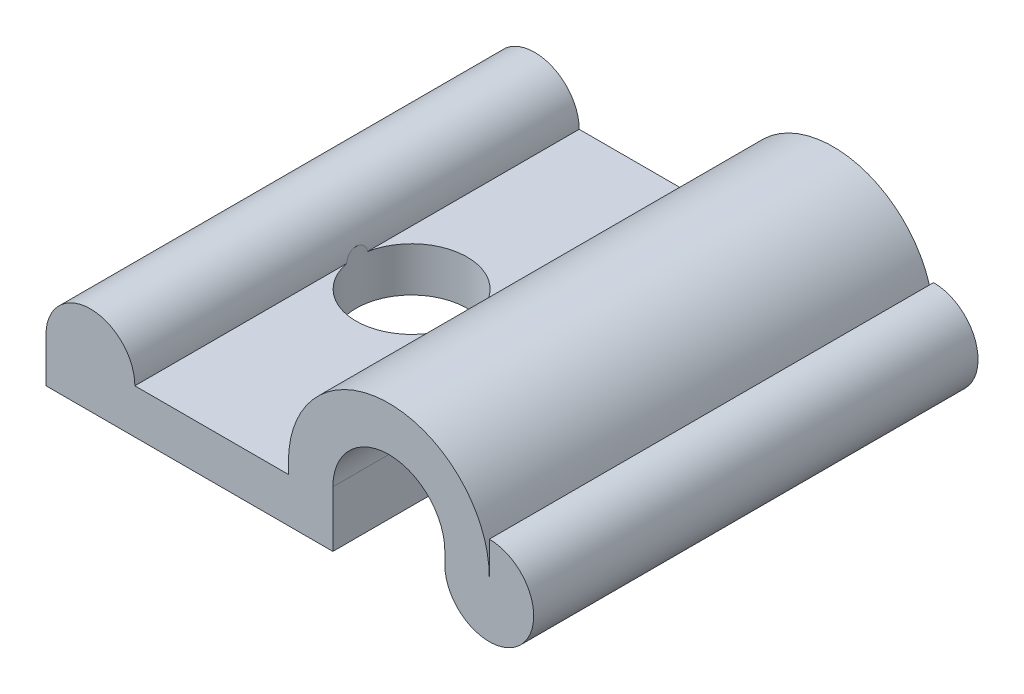
ISO-10303-21;
HEADER;
FILE_DESCRIPTION(('STEP AP214'),'2;1');
FILE_NAME('part.step','',(''),(''),'','','');
FILE_SCHEMA(('AUTOMOTIVE_DESIGN { 1 0 10303 214 1 1 1 1 }'));
ENDSEC;
DATA;
#1=APPLICATION_CONTEXT('core data for automotive mechanical design processes');
#2=APPLICATION_PROTOCOL_DEFINITION('international standard','automotive_design',2000,#1);
#3=PRODUCT_CONTEXT('',#1,'mechanical');
#4=PRODUCT('Part','Part','',(#3));
#5=PRODUCT_RELATED_PRODUCT_CATEGORY('part','',(#4));
#6=PRODUCT_DEFINITION_FORMATION('','',#4);
#7=PRODUCT_DEFINITION_CONTEXT('part definition',#1,'design');
#8=PRODUCT_DEFINITION('design','',#6,#7);
#9=PRODUCT_DEFINITION_SHAPE('','',#8);
#10=(LENGTH_UNIT() NAMED_UNIT(*) SI_UNIT(.MILLI.,.METRE.));
#11=(NAMED_UNIT(*) PLANE_ANGLE_UNIT() SI_UNIT($,.RADIAN.));
#12=(NAMED_UNIT(*) SI_UNIT($,.STERADIAN.) SOLID_ANGLE_UNIT());
#13=UNCERTAINTY_MEASURE_WITH_UNIT(LENGTH_MEASURE(1.E-05),#10,'distance_accuracy_value','');
#14=(GEOMETRIC_REPRESENTATION_CONTEXT(3) GLOBAL_UNCERTAINTY_ASSIGNED_CONTEXT((#13)) GLOBAL_UNIT_ASSIGNED_CONTEXT((#10,
#11,#12)) REPRESENTATION_CONTEXT('',''));
#15=CARTESIAN_POINT('',(0.,0.,0.));
#16=DIRECTION('',(0.,0.,1.));
#17=DIRECTION('',(1.,0.,0.));
#18=AXIS2_PLACEMENT_3D('',#15,#16,#17);
#19=CARTESIAN_POINT('',(-3.2,-3.2,12.7));
#20=DIRECTION('',(0.,1.,0.));
#21=DIRECTION('',(-1.,0.,0.));
#22=AXIS2_PLACEMENT_3D('',#19,#20,#21);
#23=PLANE('',#22);
#24=CARTESIAN_POINT('',(-11.4,-3.2,0.));
#25=DIRECTION('',(0.,-1.,0.));
#26=DIRECTION('',(1.,0.,0.));
#27=AXIS2_PLACEMENT_3D('',#24,#25,#26);
#28=CIRCLE('',#27,3.175);
#29=CARTESIAN_POINT('',(-8.225,-3.2,0.));
#30=VERTEX_POINT('',#29);
#31=EDGE_CURVE('E249',#30,#30,#28,.T.);
#32=ORIENTED_EDGE('',*,*,#31,.F.);
#33=EDGE_LOOP('',(#32));
#34=FACE_BOUND('',#33,.T.);
#35=DIRECTION('',(1.,0.,0.));
#36=VECTOR('',#35,1.);
#37=CARTESIAN_POINT('',(-3.2,-3.2,-12.7));
#38=LINE('',#37,#36);
#39=CARTESIAN_POINT('',(-19.6,-3.2,-12.7));
#40=VERTEX_POINT('',#39);
#41=CARTESIAN_POINT('',(-3.2,-3.2,-12.7));
#42=VERTEX_POINT('',#41);
#43=EDGE_CURVE('E159',#40,#42,#38,.T.);
#44=ORIENTED_EDGE('',*,*,#43,.T.);
#45=DIRECTION('',(0.,0.,-1.));
#46=VECTOR('',#45,1.);
#47=CARTESIAN_POINT('',(-3.2,-3.2,12.7));
#48=LINE('',#47,#46);
#49=CARTESIAN_POINT('',(-3.2,-3.2,12.7));
#50=VERTEX_POINT('',#49);
#51=EDGE_CURVE('E44',#50,#42,#48,.T.);
#52=ORIENTED_EDGE('',*,*,#51,.F.);
#53=DIRECTION('',(1.,0.,0.));
#54=VECTOR('',#53,1.);
#55=CARTESIAN_POINT('',(-3.2,-3.2,12.7));
#56=LINE('',#55,#54);
#57=CARTESIAN_POINT('',(-19.6,-3.2,12.7));
#58=VERTEX_POINT('',#57);
#59=EDGE_CURVE('E182',#58,#50,#56,.T.);
#60=ORIENTED_EDGE('',*,*,#59,.F.);
#61=DIRECTION('',(0.,0.,-1.));
#62=VECTOR('',#61,1.);
#63=CARTESIAN_POINT('',(-19.6,-3.2,12.7));
#64=LINE('',#63,#62);
#65=EDGE_CURVE('E155',#58,#40,#64,.T.);
#66=ORIENTED_EDGE('',*,*,#65,.T.);
#67=EDGE_LOOP('',(#44,#52,#60,#66));
#68=FACE_BOUND('',#67,.T.);
#69=ADVANCED_FACE('F32',(#34,#68),#23,.F.);
#70=CARTESIAN_POINT('',(-3.2,0.,12.7));
#71=DIRECTION('',(-1.,0.,0.));
#72=DIRECTION('',(0.,0.,1.));
#73=AXIS2_PLACEMENT_3D('',#70,#71,#72);
#74=PLANE('',#73);
#75=DIRECTION('',(0.,1.,0.));
#76=VECTOR('',#75,1.);
#77=CARTESIAN_POINT('',(-3.2,0.,-12.7));
#78=LINE('',#77,#76);
#79=CARTESIAN_POINT('',(-3.2,0.,-12.7));
#80=VERTEX_POINT('',#79);
#81=EDGE_CURVE('E162',#42,#80,#78,.T.);
#82=ORIENTED_EDGE('',*,*,#81,.T.);
#83=DIRECTION('',(0.,0.,-1.));
#84=VECTOR('',#83,1.);
#85=CARTESIAN_POINT('',(-3.2,0.,12.7));
#86=LINE('',#85,#84);
#87=CARTESIAN_POINT('',(-3.2,0.,12.7));
#88=VERTEX_POINT('',#87);
#89=EDGE_CURVE('E201',#88,#80,#86,.T.);
#90=ORIENTED_EDGE('',*,*,#89,.F.);
#91=DIRECTION('',(0.,1.,0.));
#92=VECTOR('',#91,1.);
#93=CARTESIAN_POINT('',(-3.2,0.,12.7));
#94=LINE('',#93,#92);
#95=EDGE_CURVE('E109',#50,#88,#94,.T.);
#96=ORIENTED_EDGE('',*,*,#95,.F.);
#97=ORIENTED_EDGE('',*,*,#51,.T.);
#98=EDGE_LOOP('',(#82,#90,#96,#97));
#99=FACE_BOUND('',#98,.T.);
#100=ADVANCED_FACE('F204',(#99),#74,.F.);
#101=CARTESIAN_POINT('',(0.,0.,12.7));
#102=DIRECTION('',(0.,0.,-1.));
#103=DIRECTION('',(-1.,0.,0.));
#104=AXIS2_PLACEMENT_3D('',#101,#102,#103);
#105=CYLINDRICAL_SURFACE('',#104,3.2);
#106=CARTESIAN_POINT('',(0.,0.,-12.7));
#107=DIRECTION('',(0.,0.,-1.));
#108=DIRECTION('',(1.,0.,0.));
#109=AXIS2_PLACEMENT_3D('',#106,#107,#108);
#110=CIRCLE('',#109,3.2);
#111=CARTESIAN_POINT('',(3.2,0.,-12.7));
#112=VERTEX_POINT('',#111);
#113=EDGE_CURVE('E164',#80,#112,#110,.T.);
#114=ORIENTED_EDGE('',*,*,#113,.T.);
#115=DIRECTION('',(0.,0.,-1.));
#116=VECTOR('',#115,1.);
#117=CARTESIAN_POINT('',(3.2,0.,12.7));
#118=LINE('',#117,#116);
#119=CARTESIAN_POINT('',(3.2,0.,12.7));
#120=VERTEX_POINT('',#119);
#121=EDGE_CURVE('E198',#120,#112,#118,.T.);
#122=ORIENTED_EDGE('',*,*,#121,.F.);
#123=CARTESIAN_POINT('',(0.,0.,12.7));
#124=DIRECTION('',(0.,0.,-1.));
#125=DIRECTION('',(1.,0.,0.));
#126=AXIS2_PLACEMENT_3D('',#123,#124,#125);
#127=CIRCLE('',#126,3.2);
#128=EDGE_CURVE('E225',#88,#120,#127,.T.);
#129=ORIENTED_EDGE('',*,*,#128,.F.);
#130=ORIENTED_EDGE('',*,*,#89,.T.);
#131=EDGE_LOOP('',(#114,#122,#129,#130));
#132=FACE_BOUND('',#131,.T.);
#133=ADVANCED_FACE('F216',(#132),#105,.F.);
#134=CARTESIAN_POINT('',(3.2,0.,12.7));
#135=DIRECTION('',(1.,0.,0.));
#136=DIRECTION('',(0.,0.,-1.));
#137=AXIS2_PLACEMENT_3D('',#134,#135,#136);
#138=PLANE('',#137);
#139=DIRECTION('',(0.,-1.,0.));
#140=VECTOR('',#139,1.);
#141=CARTESIAN_POINT('',(3.2,0.,-12.7));
#142=LINE('',#141,#140);
#143=CARTESIAN_POINT('',(3.2,-0.659999999999999,-12.7));
#144=VERTEX_POINT('',#143);
#145=EDGE_CURVE('E166',#112,#144,#142,.T.);
#146=ORIENTED_EDGE('',*,*,#145,.T.);
#147=DIRECTION('',(0.,0.,-1.));
#148=VECTOR('',#147,1.);
#149=CARTESIAN_POINT('',(3.2,-0.659999999999999,12.7));
#150=LINE('',#149,#148);
#151=CARTESIAN_POINT('',(3.2,-0.659999999999999,12.7));
#152=VERTEX_POINT('',#151);
#153=EDGE_CURVE('E195',#152,#144,#150,.T.);
#154=ORIENTED_EDGE('',*,*,#153,.F.);
#155=DIRECTION('',(0.,-1.,0.));
#156=VECTOR('',#155,1.);
#157=CARTESIAN_POINT('',(3.2,0.,12.7));
#158=LINE('',#157,#156);
#159=EDGE_CURVE('E222',#120,#152,#158,.T.);
#160=ORIENTED_EDGE('',*,*,#159,.F.);
#161=ORIENTED_EDGE('',*,*,#121,.T.);
#162=EDGE_LOOP('',(#146,#154,#160,#161));
#163=FACE_BOUND('',#162,.T.);
#164=ADVANCED_FACE('F220',(#163),#138,.F.);
#165=CARTESIAN_POINT('',(5.74,-0.659999999999999,12.7));
#166=DIRECTION('',(0.,0.,-1.));
#167=DIRECTION('',(-1.,0.,0.));
#168=AXIS2_PLACEMENT_3D('',#165,#166,#167);
#169=CYLINDRICAL_SURFACE('',#168,2.54);
#170=CARTESIAN_POINT('',(5.74,-0.659999999999999,-12.7));
#171=DIRECTION('',(0.,0.,1.));
#172=DIRECTION('',(1.,0.,0.));
#173=AXIS2_PLACEMENT_3D('',#170,#171,#172);
#174=CIRCLE('',#173,2.54);
#175=CARTESIAN_POINT('',(5.74,1.88,-12.7));
#176=VERTEX_POINT('',#175);
#177=EDGE_CURVE('E168',#144,#176,#174,.T.);
#178=ORIENTED_EDGE('',*,*,#177,.T.);
#179=DIRECTION('',(0.,0.,-1.));
#180=VECTOR('',#179,1.);
#181=CARTESIAN_POINT('',(5.74,1.88,12.7));
#182=LINE('',#181,#180);
#183=CARTESIAN_POINT('',(5.74,1.88,12.7));
#184=VERTEX_POINT('',#183);
#185=EDGE_CURVE('E192',#184,#176,#182,.T.);
#186=ORIENTED_EDGE('',*,*,#185,.F.);
#187=CARTESIAN_POINT('',(5.74,-0.659999999999999,12.7));
#188=DIRECTION('',(0.,0.,1.));
#189=DIRECTION('',(1.,0.,0.));
#190=AXIS2_PLACEMENT_3D('',#187,#188,#189);
#191=CIRCLE('',#190,2.54);
#192=EDGE_CURVE('E224',#152,#184,#191,.T.);
#193=ORIENTED_EDGE('',*,*,#192,.F.);
#194=ORIENTED_EDGE('',*,*,#153,.T.);
#195=EDGE_LOOP('',(#178,#186,#193,#194));
#196=FACE_BOUND('',#195,.T.);
#197=ADVANCED_FACE('F266',(#196),#169,.T.);
#198=CARTESIAN_POINT('',(5.74,0.,12.7));
#199=DIRECTION('',(1.,0.,0.));
#200=DIRECTION('',(0.,1.,0.));
#201=AXIS2_PLACEMENT_3D('',#198,#199,#200);
#202=PLANE('',#201);
#203=DIRECTION('',(0.,-1.,0.));
#204=VECTOR('',#203,1.);
#205=CARTESIAN_POINT('',(5.74,0.,-12.7));
#206=LINE('',#205,#204);
#207=CARTESIAN_POINT('',(5.74,0.,-12.7));
#208=VERTEX_POINT('',#207);
#209=EDGE_CURVE('E170',#176,#208,#206,.T.);
#210=ORIENTED_EDGE('',*,*,#209,.T.);
#211=DIRECTION('',(0.,0.,-1.));
#212=VECTOR('',#211,1.);
#213=CARTESIAN_POINT('',(5.74,0.,12.7));
#214=LINE('',#213,#212);
#215=CARTESIAN_POINT('',(5.74,0.,12.7));
#216=VERTEX_POINT('',#215);
#217=EDGE_CURVE('E189',#216,#208,#214,.T.);
#218=ORIENTED_EDGE('',*,*,#217,.F.);
#219=DIRECTION('',(0.,-1.,0.));
#220=VECTOR('',#219,1.);
#221=CARTESIAN_POINT('',(5.74,0.,12.7));
#222=LINE('',#221,#220);
#223=EDGE_CURVE('E227',#184,#216,#222,.T.);
#224=ORIENTED_EDGE('',*,*,#223,.F.);
#225=ORIENTED_EDGE('',*,*,#185,.T.);
#226=EDGE_LOOP('',(#210,#218,#224,#225));
#227=FACE_BOUND('',#226,.T.);
#228=ADVANCED_FACE('F269',(#227),#202,.F.);
#229=CARTESIAN_POINT('',(0.,0.,12.7));
#230=DIRECTION('',(0.,0.,-1.));
#231=DIRECTION('',(-1.,0.,0.));
#232=AXIS2_PLACEMENT_3D('',#229,#230,#231);
#233=CYLINDRICAL_SURFACE('',#232,5.74);
#234=CARTESIAN_POINT('',(0.,0.,-12.7));
#235=DIRECTION('',(0.,0.,1.));
#236=DIRECTION('',(1.,0.,0.));
#237=AXIS2_PLACEMENT_3D('',#234,#235,#236);
#238=CIRCLE('',#237,5.74);
#239=CARTESIAN_POINT('',(-5.74,0.,-12.7));
#240=VERTEX_POINT('',#239);
#241=EDGE_CURVE('E172',#208,#240,#238,.T.);
#242=ORIENTED_EDGE('',*,*,#241,.T.);
#243=DIRECTION('',(0.,0.,-1.));
#244=VECTOR('',#243,1.);
#245=CARTESIAN_POINT('',(-5.74,0.,12.7));
#246=LINE('',#245,#244);
#247=CARTESIAN_POINT('',(-5.74,0.,12.7));
#248=VERTEX_POINT('',#247);
#249=EDGE_CURVE('E186',#248,#240,#246,.T.);
#250=ORIENTED_EDGE('',*,*,#249,.F.);
#251=CARTESIAN_POINT('',(0.,0.,12.7));
#252=DIRECTION('',(0.,0.,1.));
#253=DIRECTION('',(1.,0.,0.));
#254=AXIS2_PLACEMENT_3D('',#251,#252,#253);
#255=CIRCLE('',#254,5.74);
#256=EDGE_CURVE('E233',#216,#248,#255,.T.);
#257=ORIENTED_EDGE('',*,*,#256,.F.);
#258=ORIENTED_EDGE('',*,*,#217,.T.);
#259=EDGE_LOOP('',(#242,#250,#257,#258));
#260=FACE_BOUND('',#259,.T.);
#261=ADVANCED_FACE('F239',(#260),#233,.T.);
#262=CARTESIAN_POINT('',(-5.74,0.,12.7));
#263=DIRECTION('',(1.,0.,0.));
#264=DIRECTION('',(0.,0.,-1.));
#265=AXIS2_PLACEMENT_3D('',#262,#263,#264);
#266=PLANE('',#265);
#267=DIRECTION('',(0.,-1.,0.));
#268=VECTOR('',#267,1.);
#269=CARTESIAN_POINT('',(-5.74,0.,-12.7));
#270=LINE('',#269,#268);
#271=CARTESIAN_POINT('',(-5.74,-0.660000000000002,-12.7));
#272=VERTEX_POINT('',#271);
#273=EDGE_CURVE('E174',#240,#272,#270,.T.);
#274=ORIENTED_EDGE('',*,*,#273,.T.);
#275=DIRECTION('',(0.,0.,-1.));
#276=VECTOR('',#275,1.);
#277=CARTESIAN_POINT('',(-5.74,-0.660000000000002,12.7));
#278=LINE('',#277,#276);
#279=CARTESIAN_POINT('',(-5.74,-0.660000000000002,12.7));
#280=VERTEX_POINT('',#279);
#281=EDGE_CURVE('E149',#280,#272,#278,.T.);
#282=ORIENTED_EDGE('',*,*,#281,.F.);
#283=DIRECTION('',(0.,-1.,0.));
#284=VECTOR('',#283,1.);
#285=CARTESIAN_POINT('',(-5.74,0.,12.7));
#286=LINE('',#285,#284);
#287=EDGE_CURVE('E139',#248,#280,#286,.T.);
#288=ORIENTED_EDGE('',*,*,#287,.F.);
#289=ORIENTED_EDGE('',*,*,#249,.T.);
#290=EDGE_LOOP('',(#274,#282,#288,#289));
#291=FACE_BOUND('',#290,.T.);
#292=ADVANCED_FACE('F243',(#291),#266,.F.);
#293=CARTESIAN_POINT('',(-14.52,-0.660000000000003,12.7));
#294=DIRECTION('',(0.,-1.,0.));
#295=DIRECTION('',(1.,0.,0.));
#296=AXIS2_PLACEMENT_3D('',#293,#294,#295);
#297=PLANE('',#296);
#298=DIRECTION('',(0.,0.,-1.));
#299=VECTOR('',#298,1.);
#300=CARTESIAN_POINT('',(-14.52,-0.660000000000003,12.7));
#301=LINE('',#300,#299);
#302=CARTESIAN_POINT('',(-14.52,-0.660000000000003,-0.588408871469511));
#303=VERTEX_POINT('',#302);
#304=CARTESIAN_POINT('',(-14.52,-0.660000000000003,-12.7));
#305=VERTEX_POINT('',#304);
#306=EDGE_CURVE('E150',#303,#305,#301,.T.);
#307=ORIENTED_EDGE('',*,*,#306,.F.);
#308=CARTESIAN_POINT('',(-11.4,-0.660000000000003,0.));
#309=DIRECTION('',(0.,-1.,0.));
#310=DIRECTION('',(1.,0.,0.));
#311=AXIS2_PLACEMENT_3D('',#308,#309,#310);
#312=CIRCLE('',#311,3.175);
#313=CARTESIAN_POINT('',(-14.52,-0.660000000000001,0.588408871449143));
#314=VERTEX_POINT('',#313);
#315=EDGE_CURVE('E50',#303,#314,#312,.T.);
#316=ORIENTED_EDGE('',*,*,#315,.T.);
#317=CARTESIAN_POINT('',(-14.52,-0.660000000000003,12.7));
#318=VERTEX_POINT('',#317);
#319=EDGE_CURVE('E145',#318,#314,#301,.T.);
#320=ORIENTED_EDGE('',*,*,#319,.F.);
#321=DIRECTION('',(-1.,0.,0.));
#322=VECTOR('',#321,1.);
#323=CARTESIAN_POINT('',(-14.52,-0.660000000000003,12.7));
#324=LINE('',#323,#322);
#325=EDGE_CURVE('E132',#280,#318,#324,.T.);
#326=ORIENTED_EDGE('',*,*,#325,.F.);
#327=ORIENTED_EDGE('',*,*,#281,.T.);
#328=DIRECTION('',(-1.,0.,0.));
#329=VECTOR('',#328,1.);
#330=CARTESIAN_POINT('',(-14.52,-0.660000000000003,-12.7));
#331=LINE('',#330,#329);
#332=EDGE_CURVE('E176',#272,#305,#331,.T.);
#333=ORIENTED_EDGE('',*,*,#332,.T.);
#334=EDGE_LOOP('',(#307,#316,#320,#326,#327,#333));
#335=FACE_BOUND('',#334,.T.);
#336=ADVANCED_FACE('F147',(#335),#297,.F.);
#337=CARTESIAN_POINT('',(-17.06,-0.660000000000002,12.7));
#338=DIRECTION('',(0.,0.,-1.));
#339=DIRECTION('',(-1.,0.,0.));
#340=AXIS2_PLACEMENT_3D('',#337,#338,#339);
#341=CYLINDRICAL_SURFACE('',#340,2.54);
#342=ORIENTED_EDGE('',*,*,#319,.T.);
#343=CARTESIAN_POINT('',(-14.52,-0.660000000000001,0.588408871449143));
#344=CARTESIAN_POINT('',(-14.5199824611973,-0.632334359373635,0.588444358368726));
#345=CARTESIAN_POINT('',(-14.5204514513072,-0.604693985257013,0.586014959380791));
#346=CARTESIAN_POINT('',(-14.5222274583382,-0.55034928212371,0.576508118297592));
#347=CARTESIAN_POINT('',(-14.5235315004852,-0.5236419838776,0.569447173372966));
#348=CARTESIAN_POINT('',(-14.5268435494632,-0.471853996434932,0.550959779728202));
#349=CARTESIAN_POINT('',(-14.5288512239634,-0.446772545953274,0.539535391667166));
#350=CARTESIAN_POINT('',(-14.5333478411074,-0.398833417422344,0.512777712889967));
#351=CARTESIAN_POINT('',(-14.5358370304761,-0.375976888471642,0.49744241696354));
#352=CARTESIAN_POINT('',(-14.5411169306575,-0.332396545631538,0.462947664331842));
#353=CARTESIAN_POINT('',(-14.5439139114377,-0.311745847464798,0.443697144263751));
#354=CARTESIAN_POINT('',(-14.5494833453637,-0.273635297142572,0.402264420075516));
#355=CARTESIAN_POINT('',(-14.5522557899598,-0.256176518562757,0.380081233884286));
#356=CARTESIAN_POINT('',(-14.557793121698,-0.22311382958261,0.331106332701532));
#357=CARTESIAN_POINT('',(-14.5605306818686,-0.20785898514783,0.304076048357201));
#358=CARTESIAN_POINT('',(-14.5654261120474,-0.181586096303336,0.247984312830991));
#359=CARTESIAN_POINT('',(-14.5675837449735,-0.170569783872172,0.218922037042653));
#360=CARTESIAN_POINT('',(-14.5713136006467,-0.15192461538226,0.156430244887873));
#361=CARTESIAN_POINT('',(-14.5728034996221,-0.144756794197194,0.122857884132972));
#362=CARTESIAN_POINT('',(-14.5747058504668,-0.135658319322479,0.0549764541353972));
#363=CARTESIAN_POINT('',(-14.5751178290268,-0.133729966241918,0.0206670679328016));
#364=CARTESIAN_POINT('',(-14.574814177498,-0.135163821503042,-0.0501377504833061));
#365=CARTESIAN_POINT('',(-14.5740214287947,-0.138887837748936,-0.086626202994064));
#366=CARTESIAN_POINT('',(-14.5712472833927,-0.152302843683221,-0.158455355514548));
#367=CARTESIAN_POINT('',(-14.5692656944768,-0.161994798302782,-0.1937958689458));
#368=CARTESIAN_POINT('',(-14.5643471611929,-0.187261542803357,-0.262107859397585));
#369=CARTESIAN_POINT('',(-14.5614136863819,-0.202815000655472,-0.295087416957984));
#370=CARTESIAN_POINT('',(-14.5549522810438,-0.239662081491441,-0.357615398953452));
#371=CARTESIAN_POINT('',(-14.5514246495268,-0.260952820398773,-0.387165536676366));
#372=CARTESIAN_POINT('',(-14.5445497785192,-0.307002664406148,-0.439399809115526));
#373=CARTESIAN_POINT('',(-14.541210243075,-0.331355998525105,-0.462441579223707));
#374=CARTESIAN_POINT('',(-14.5348950870538,-0.384056072010531,-0.503478647188341));
#375=CARTESIAN_POINT('',(-14.5319192692703,-0.412400629246769,-0.521476686643054));
#376=CARTESIAN_POINT('',(-14.5270658380833,-0.468806496436926,-0.549788116379876));
#377=CARTESIAN_POINT('',(-14.5251024026458,-0.496541833841401,-0.560737705652332));
#378=CARTESIAN_POINT('',(-14.5220730232758,-0.553549140381354,-0.577374404324905));
#379=CARTESIAN_POINT('',(-14.5210049392833,-0.582817266752449,-0.583074065294637));
#380=CARTESIAN_POINT('',(-14.5201478742508,-0.628182596419121,-0.587620463335388));
#381=CARTESIAN_POINT('',(-14.519995468473,-0.64409584725238,-0.588419165029675));
#382=CARTESIAN_POINT('',(-14.5199999999999,-0.659999999997965,-0.588408871469512));
#383=B_SPLINE_CURVE_WITH_KNOTS('',3,(#343,#344,#345,#346,#347,#348,#349,#350,#351,#352,#353,
#354,#355,#356,#357,#358,#359,#360,#361,#362,#363,#364,#365,#366,#367,#368,#369,#370,#371,#372,
#373,#374,#375,#376,#377,#378,#379,#380,#381,#382),.UNSPECIFIED.,.F.,.F.,(4,2,2,2,2,2,2,2,2,2,2,
2,2,2,2,2,2,2,2,4),(0.,0.0828470903431338,0.165400677276317,0.247915325950339,0.330472367093999,
0.415230677828844,0.50001744408268,0.593107122179316,0.686234798932847,0.788876378690334,
0.891563020277447,1.00110530989288,1.11066531559851,1.21983038599492,1.32894068219071,
1.42944892767204,1.52990243389267,1.6190697316873,1.7080232900366,1.75574089908901),.UNSPECIFIED.);
#384=EDGE_CURVE('E11',#314,#303,#383,.T.);
#385=ORIENTED_EDGE('',*,*,#384,.T.);
#386=ORIENTED_EDGE('',*,*,#306,.T.);
#387=CARTESIAN_POINT('',(-17.06,-0.660000000000002,-12.7));
#388=DIRECTION('',(0.,0.,1.));
#389=DIRECTION('',(1.,0.,0.));
#390=AXIS2_PLACEMENT_3D('',#387,#388,#389);
#391=CIRCLE('',#390,2.54);
#392=CARTESIAN_POINT('',(-19.6,-0.660000000000001,-12.7));
#393=VERTEX_POINT('',#392);
#394=EDGE_CURVE('E179',#305,#393,#391,.T.);
#395=ORIENTED_EDGE('',*,*,#394,.T.);
#396=DIRECTION('',(0.,0.,-1.));
#397=VECTOR('',#396,1.);
#398=CARTESIAN_POINT('',(-19.6,-0.660000000000001,12.7));
#399=LINE('',#398,#397);
#400=CARTESIAN_POINT('',(-19.6,-0.660000000000001,12.7));
#401=VERTEX_POINT('',#400);
#402=EDGE_CURVE('E153',#401,#393,#399,.T.);
#403=ORIENTED_EDGE('',*,*,#402,.F.);
#404=CARTESIAN_POINT('',(-17.06,-0.660000000000002,12.7));
#405=DIRECTION('',(0.,0.,1.));
#406=DIRECTION('',(1.,0.,0.));
#407=AXIS2_PLACEMENT_3D('',#404,#405,#406);
#408=CIRCLE('',#407,2.54);
#409=EDGE_CURVE('E136',#318,#401,#408,.T.);
#410=ORIENTED_EDGE('',*,*,#409,.F.);
#411=EDGE_LOOP('',(#342,#385,#386,#395,#403,#410));
#412=FACE_BOUND('',#411,.T.);
#413=ADVANCED_FACE('F152',(#412),#341,.T.);
#414=CARTESIAN_POINT('',(-19.6,-3.2,12.7));
#415=DIRECTION('',(1.,0.,0.));
#416=DIRECTION('',(0.,1.,0.));
#417=AXIS2_PLACEMENT_3D('',#414,#415,#416);
#418=PLANE('',#417);
#419=DIRECTION('',(0.,-1.,0.));
#420=VECTOR('',#419,1.);
#421=CARTESIAN_POINT('',(-19.6,-3.2,-12.7));
#422=LINE('',#421,#420);
#423=EDGE_CURVE('E100',#393,#40,#422,.T.);
#424=ORIENTED_EDGE('',*,*,#423,.T.);
#425=ORIENTED_EDGE('',*,*,#65,.F.);
#426=DIRECTION('',(0.,-1.,0.));
#427=VECTOR('',#426,1.);
#428=CARTESIAN_POINT('',(-19.6,-3.2,12.7));
#429=LINE('',#428,#427);
#430=EDGE_CURVE('E58',#401,#58,#429,.T.);
#431=ORIENTED_EDGE('',*,*,#430,.F.);
#432=ORIENTED_EDGE('',*,*,#402,.T.);
#433=EDGE_LOOP('',(#424,#425,#431,#432));
#434=FACE_BOUND('',#433,.T.);
#435=ADVANCED_FACE('F245',(#434),#418,.F.);
#436=CARTESIAN_POINT('',(-17.06,-0.660000000000002,12.7));
#437=DIRECTION('',(0.,0.,1.));
#438=DIRECTION('',(1.,0.,0.));
#439=AXIS2_PLACEMENT_3D('',#436,#437,#438);
#440=PLANE('',#439);
#441=ORIENTED_EDGE('',*,*,#59,.T.);
#442=ORIENTED_EDGE('',*,*,#95,.T.);
#443=ORIENTED_EDGE('',*,*,#128,.T.);
#444=ORIENTED_EDGE('',*,*,#159,.T.);
#445=ORIENTED_EDGE('',*,*,#192,.T.);
#446=ORIENTED_EDGE('',*,*,#223,.T.);
#447=ORIENTED_EDGE('',*,*,#256,.T.);
#448=ORIENTED_EDGE('',*,*,#287,.T.);
#449=ORIENTED_EDGE('',*,*,#325,.T.);
#450=ORIENTED_EDGE('',*,*,#409,.T.);
#451=ORIENTED_EDGE('',*,*,#430,.T.);
#452=EDGE_LOOP('',(#441,#442,#443,#444,#445,#446,#447,#448,#449,#450,#451));
#453=FACE_BOUND('',#452,.T.);
#454=ADVANCED_FACE('F134',(#453),#440,.T.);
#455=CARTESIAN_POINT('',(-17.06,-0.660000000000002,-12.7));
#456=DIRECTION('',(0.,0.,1.));
#457=DIRECTION('',(1.,0.,0.));
#458=AXIS2_PLACEMENT_3D('',#455,#456,#457);
#459=PLANE('',#458);
#460=ORIENTED_EDGE('',*,*,#43,.F.);
#461=ORIENTED_EDGE('',*,*,#423,.F.);
#462=ORIENTED_EDGE('',*,*,#394,.F.);
#463=ORIENTED_EDGE('',*,*,#332,.F.);
#464=ORIENTED_EDGE('',*,*,#273,.F.);
#465=ORIENTED_EDGE('',*,*,#241,.F.);
#466=ORIENTED_EDGE('',*,*,#209,.F.);
#467=ORIENTED_EDGE('',*,*,#177,.F.);
#468=ORIENTED_EDGE('',*,*,#145,.F.);
#469=ORIENTED_EDGE('',*,*,#113,.F.);
#470=ORIENTED_EDGE('',*,*,#81,.F.);
#471=EDGE_LOOP('',(#460,#461,#462,#463,#464,#465,#466,#467,#468,#469,#470));
#472=FACE_BOUND('',#471,.T.);
#473=ADVANCED_FACE('F209',(#472),#459,.F.);
#474=CARTESIAN_POINT('',(-11.4,5.74,0.));
#475=DIRECTION('',(0.,-1.,0.));
#476=DIRECTION('',(1.,0.,0.));
#477=AXIS2_PLACEMENT_3D('',#474,#475,#476);
#478=CYLINDRICAL_SURFACE('',#477,3.175);
#479=ORIENTED_EDGE('',*,*,#31,.T.);
#480=EDGE_LOOP('',(#479));
#481=FACE_BOUND('',#480,.T.);
#482=ORIENTED_EDGE('',*,*,#384,.F.);
#483=ORIENTED_EDGE('',*,*,#315,.F.);
#484=EDGE_LOOP('',(#482,#483));
#485=FACE_BOUND('',#484,.T.);
#486=ADVANCED_FACE('F253',(#481,#485),#478,.F.);
#487=CLOSED_SHELL('',(#69,#100,#133,#164,#197,#228,#261,#292,#336,#413,#435,#454,#473,#486));
#488=MANIFOLD_SOLID_BREP('B2',#487);
#489=ADVANCED_BREP_SHAPE_REPRESENTATION('',(#18,#488),#14);
#490=SHAPE_DEFINITION_REPRESENTATION(#9,#489);
ENDSEC;
END-ISO-10303-21;
